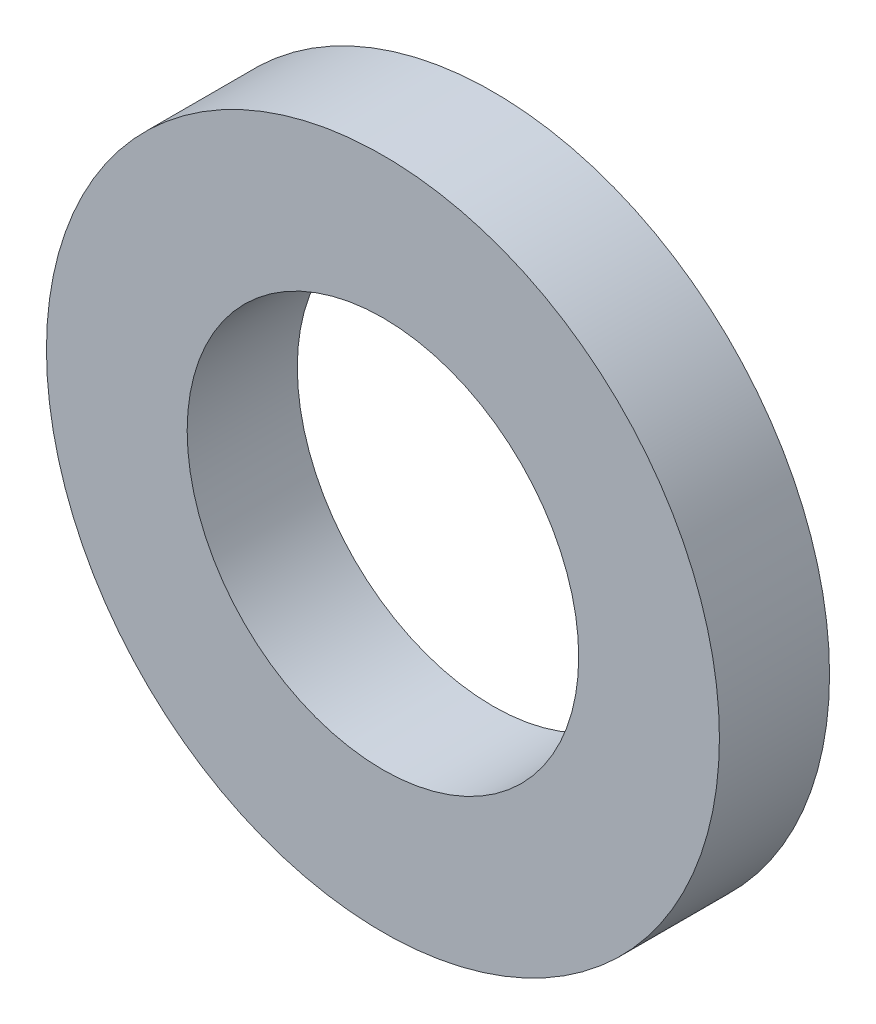
ISO-10303-21;
HEADER;
FILE_DESCRIPTION(('STEP AP214'),'2;1');
FILE_NAME('part.step','',(''),(''),'','','');
FILE_SCHEMA(('AUTOMOTIVE_DESIGN { 1 0 10303 214 1 1 1 1 }'));
ENDSEC;
DATA;
#1=APPLICATION_CONTEXT('core data for automotive mechanical design processes');
#2=APPLICATION_PROTOCOL_DEFINITION('international standard','automotive_design',2000,#1);
#3=PRODUCT_CONTEXT('',#1,'mechanical');
#4=PRODUCT('Part','Part','',(#3));
#5=PRODUCT_RELATED_PRODUCT_CATEGORY('part','',(#4));
#6=PRODUCT_DEFINITION_FORMATION('','',#4);
#7=PRODUCT_DEFINITION_CONTEXT('part definition',#1,'design');
#8=PRODUCT_DEFINITION('design','',#6,#7);
#9=PRODUCT_DEFINITION_SHAPE('','',#8);
#10=(LENGTH_UNIT() NAMED_UNIT(*) SI_UNIT(.MILLI.,.METRE.));
#11=(NAMED_UNIT(*) PLANE_ANGLE_UNIT() SI_UNIT($,.RADIAN.));
#12=(NAMED_UNIT(*) SI_UNIT($,.STERADIAN.) SOLID_ANGLE_UNIT());
#13=UNCERTAINTY_MEASURE_WITH_UNIT(LENGTH_MEASURE(1.E-05),#10,'distance_accuracy_value','');
#14=(GEOMETRIC_REPRESENTATION_CONTEXT(3) GLOBAL_UNCERTAINTY_ASSIGNED_CONTEXT((#13)) GLOBAL_UNIT_ASSIGNED_CONTEXT((#10,
#11,#12)) REPRESENTATION_CONTEXT('',''));
#15=CARTESIAN_POINT('',(0.,0.,0.));
#16=DIRECTION('',(0.,0.,1.));
#17=DIRECTION('',(1.,0.,0.));
#18=AXIS2_PLACEMENT_3D('',#15,#16,#17);
#19=CARTESIAN_POINT('',(-1.52655665885959E-13,3.33066907387547E-13,1.80000000000002));
#20=DIRECTION('',(0.,0.,0.999999999999913));
#21=DIRECTION('',(0.999999999999978,0.,0.));
#22=AXIS2_PLACEMENT_3D('',#19,#20,#21);
#23=PLANE('',#22);
#24=CARTESIAN_POINT('',(-1.52655665885959E-13,3.33066907387547E-13,1.80000000000002));
#25=DIRECTION('',(0.,0.,0.999999999999913));
#26=DIRECTION('',(0.999999999999978,0.,0.));
#27=AXIS2_PLACEMENT_3D('',#24,#25,#26);
#28=CIRCLE('',#27,5.5);
#29=CARTESIAN_POINT('',(-5.50000000000003,0.,1.80000000000018));
#30=VERTEX_POINT('',#29);
#31=EDGE_CURVE('E12',#30,#30,#28,.T.);
#32=ORIENTED_EDGE('',*,*,#31,.T.);
#33=EDGE_LOOP('',(#32));
#34=FACE_BOUND('',#33,.T.);
#35=CARTESIAN_POINT('',(-1.52655665885959E-13,3.33066907387547E-13,1.80000000000002));
#36=DIRECTION('',(0.,0.,0.999999999999913));
#37=DIRECTION('',(0.999999999999978,0.,0.));
#38=AXIS2_PLACEMENT_3D('',#35,#36,#37);
#39=CIRCLE('',#38,3.2);
#40=CARTESIAN_POINT('',(-3.20000000000008,1.68576264059087E-13,1.80000000000011));
#41=VERTEX_POINT('',#40);
#42=EDGE_CURVE('E51',#41,#41,#39,.T.);
#43=ORIENTED_EDGE('',*,*,#42,.F.);
#44=EDGE_LOOP('',(#43));
#45=FACE_BOUND('',#44,.T.);
#46=ADVANCED_FACE('F40',(#34,#45),#23,.T.);
#47=CARTESIAN_POINT('',(0.,0.,0.));
#48=DIRECTION('',(0.,0.,0.999999999999913));
#49=DIRECTION('',(0.999999999999978,0.,0.));
#50=AXIS2_PLACEMENT_3D('',#47,#48,#49);
#51=PLANE('',#50);
#52=CARTESIAN_POINT('',(0.,0.,0.));
#53=DIRECTION('',(0.,0.,0.999999999999913));
#54=DIRECTION('',(0.999999999999978,0.,0.));
#55=AXIS2_PLACEMENT_3D('',#52,#53,#54);
#56=CIRCLE('',#55,5.5);
#57=CARTESIAN_POINT('',(-5.50000000000008,0.,1.51571463713474E-13));
#58=VERTEX_POINT('',#57);
#59=EDGE_CURVE('E44',#58,#58,#56,.T.);
#60=ORIENTED_EDGE('',*,*,#59,.F.);
#61=EDGE_LOOP('',(#60));
#62=FACE_BOUND('',#61,.T.);
#63=CARTESIAN_POINT('',(0.,0.,0.));
#64=DIRECTION('',(0.,0.,0.999999999999913));
#65=DIRECTION('',(0.999999999999978,0.,0.));
#66=AXIS2_PLACEMENT_3D('',#63,#64,#65);
#67=CIRCLE('',#66,3.2);
#68=CARTESIAN_POINT('',(-3.20000000000013,1.35958779787182E-13,0.));
#69=VERTEX_POINT('',#68);
#70=EDGE_CURVE('E53',#69,#69,#67,.T.);
#71=ORIENTED_EDGE('',*,*,#70,.T.);
#72=EDGE_LOOP('',(#71));
#73=FACE_BOUND('',#72,.T.);
#74=ADVANCED_FACE('F63',(#62,#73),#51,.F.);
#75=CARTESIAN_POINT('',(-1.52655665885959E-13,3.33066907387547E-13,1.80000000000002));
#76=DIRECTION('',(0.,0.,-0.999999999999913));
#77=DIRECTION('',(-0.999999999999978,0.,0.));
#78=AXIS2_PLACEMENT_3D('',#75,#76,#77);
#79=CYLINDRICAL_SURFACE('',#78,5.5);
#80=CARTESIAN_POINT('',(-5.50000000000003,0.,1.80000000000018));
#81=CARTESIAN_POINT('',(-5.50000000000003,0.,1.78125000000018));
#82=CARTESIAN_POINT('',(-5.50000000000003,0.,1.76250000000017));
#83=CARTESIAN_POINT('',(-5.50000000000003,0.,1.72500000000017));
#84=CARTESIAN_POINT('',(-5.50000000000003,0.,1.70625000000017));
#85=CARTESIAN_POINT('',(-5.50000000000003,0.,1.66875000000017));
#86=CARTESIAN_POINT('',(-5.50000000000003,0.,1.65000000000017));
#87=CARTESIAN_POINT('',(-5.50000000000003,0.,1.61250000000017));
#88=CARTESIAN_POINT('',(-5.50000000000003,0.,1.59375000000017));
#89=CARTESIAN_POINT('',(-5.50000000000004,0.,1.55625000000017));
#90=CARTESIAN_POINT('',(-5.50000000000004,0.,1.53750000000017));
#91=CARTESIAN_POINT('',(-5.50000000000004,0.,1.50000000000017));
#92=CARTESIAN_POINT('',(-5.50000000000004,0.,1.48125000000017));
#93=CARTESIAN_POINT('',(-5.50000000000004,0.,1.44375000000017));
#94=CARTESIAN_POINT('',(-5.50000000000004,0.,1.42500000000017));
#95=CARTESIAN_POINT('',(-5.50000000000004,0.,1.38750000000017));
#96=CARTESIAN_POINT('',(-5.50000000000004,0.,1.36875000000017));
#97=CARTESIAN_POINT('',(-5.50000000000004,0.,1.33125000000017));
#98=CARTESIAN_POINT('',(-5.50000000000004,0.,1.31250000000017));
#99=CARTESIAN_POINT('',(-5.50000000000004,0.,1.27500000000017));
#100=CARTESIAN_POINT('',(-5.50000000000004,0.,1.25625000000017));
#101=CARTESIAN_POINT('',(-5.50000000000005,0.,1.21875000000017));
#102=CARTESIAN_POINT('',(-5.50000000000005,0.,1.20000000000017));
#103=CARTESIAN_POINT('',(-5.50000000000005,0.,1.16250000000017));
#104=CARTESIAN_POINT('',(-5.50000000000005,0.,1.14375000000017));
#105=CARTESIAN_POINT('',(-5.50000000000005,0.,1.10625000000017));
#106=CARTESIAN_POINT('',(-5.50000000000005,0.,1.08750000000017));
#107=CARTESIAN_POINT('',(-5.50000000000005,0.,1.05000000000017));
#108=CARTESIAN_POINT('',(-5.50000000000005,0.,1.03125000000017));
#109=CARTESIAN_POINT('',(-5.50000000000005,0.,0.993750000000165));
#110=CARTESIAN_POINT('',(-5.50000000000005,0.,0.975000000000164));
#111=CARTESIAN_POINT('',(-5.50000000000005,0.,0.937500000000164));
#112=CARTESIAN_POINT('',(-5.50000000000005,0.,0.918750000000164));
#113=CARTESIAN_POINT('',(-5.50000000000005,0.,0.881250000000163));
#114=CARTESIAN_POINT('',(-5.50000000000006,0.,0.862500000000163));
#115=CARTESIAN_POINT('',(-5.50000000000006,0.,0.825000000000162));
#116=CARTESIAN_POINT('',(-5.50000000000006,0.,0.806250000000162));
#117=CARTESIAN_POINT('',(-5.50000000000006,0.,0.768750000000162));
#118=CARTESIAN_POINT('',(-5.50000000000006,0.,0.750000000000161));
#119=CARTESIAN_POINT('',(-5.50000000000006,0.,0.712500000000161));
#120=CARTESIAN_POINT('',(-5.50000000000006,0.,0.693750000000161));
#121=CARTESIAN_POINT('',(-5.50000000000006,0.,0.65625000000016));
#122=CARTESIAN_POINT('',(-5.50000000000006,0.,0.63750000000016));
#123=CARTESIAN_POINT('',(-5.50000000000006,0.,0.60000000000016));
#124=CARTESIAN_POINT('',(-5.50000000000006,0.,0.581250000000159));
#125=CARTESIAN_POINT('',(-5.50000000000006,0.,0.543750000000159));
#126=CARTESIAN_POINT('',(-5.50000000000006,0.,0.525000000000158));
#127=CARTESIAN_POINT('',(-5.50000000000007,0.,0.487500000000158));
#128=CARTESIAN_POINT('',(-5.50000000000007,0.,0.468750000000158));
#129=CARTESIAN_POINT('',(-5.50000000000007,0.,0.431250000000157));
#130=CARTESIAN_POINT('',(-5.50000000000007,0.,0.412500000000157));
#131=CARTESIAN_POINT('',(-5.50000000000007,0.,0.375000000000156));
#132=CARTESIAN_POINT('',(-5.50000000000007,0.,0.356250000000156));
#133=CARTESIAN_POINT('',(-5.50000000000007,0.,0.318750000000156));
#134=CARTESIAN_POINT('',(-5.50000000000007,0.,0.300000000000156));
#135=CARTESIAN_POINT('',(-5.50000000000007,0.,0.262500000000155));
#136=CARTESIAN_POINT('',(-5.50000000000007,0.,0.243750000000155));
#137=CARTESIAN_POINT('',(-5.50000000000007,0.,0.206250000000154));
#138=CARTESIAN_POINT('',(-5.50000000000007,0.,0.187500000000154));
#139=CARTESIAN_POINT('',(-5.50000000000008,0.,0.150000000000153));
#140=CARTESIAN_POINT('',(-5.50000000000008,0.,0.131250000000153));
#141=CARTESIAN_POINT('',(-5.50000000000008,0.,0.0937500000001527));
#142=CARTESIAN_POINT('',(-5.50000000000008,0.,0.0750000000001525));
#143=CARTESIAN_POINT('',(-5.50000000000008,0.,0.0375000000001521));
#144=CARTESIAN_POINT('',(-5.50000000000008,0.,0.0187500000001518));
#145=CARTESIAN_POINT('',(-5.50000000000008,0.,1.51571463713474E-13));
#146=B_SPLINE_CURVE_WITH_KNOTS('',3,(#80,#81,#82,#83,#84,#85,#86,#87,#88,#89,#90,#91,#92,#93,
#94,#95,#96,#97,#98,#99,#100,#101,#102,#103,#104,#105,#106,#107,#108,#109,#110,#111,#112,#113,
#114,#115,#116,#117,#118,#119,#120,#121,#122,#123,#124,#125,#126,#127,#128,#129,#130,#131,#132,
#133,#134,#135,#136,#137,#138,#139,#140,#141,#142,#143,#144,#145),.UNSPECIFIED.,.F.,.F.,(4,2,2,
2,2,2,2,2,2,2,2,2,2,2,2,2,2,2,2,2,2,2,2,2,2,2,2,2,2,2,2,2,4),(0.,0.0562500000000005,
0.112500000000001,0.168750000000002,0.225000000000003,0.281250000000003,0.337500000000004,
0.393750000000005,0.450000000000006,0.506250000000007,0.562500000000007,0.618750000000008,
0.675000000000009,0.73125000000001,0.78750000000001,0.843750000000011,0.900000000000012,
0.956250000000013,1.01250000000001,1.06875000000001,1.12500000000001,1.18125000000002,
1.23750000000002,1.29375000000002,1.35000000000002,1.40625000000002,1.46250000000002,
1.51875000000002,1.57500000000002,1.63125000000002,1.68750000000002,1.74375000000002,
1.80000000000002),.UNSPECIFIED.);
#147=EDGE_CURVE('BSEAM42',#30,#58,#146,.T.);
#148=ORIENTED_EDGE('',*,*,#31,.F.);
#149=ORIENTED_EDGE('',*,*,#59,.T.);
#150=ORIENTED_EDGE('',*,*,#147,.T.);
#151=ORIENTED_EDGE('',*,*,#147,.F.);
#152=EDGE_LOOP('',(#148,#150,#149,#151));
#153=FACE_BOUND('',#152,.T.);
#154=ADVANCED_FACE('F42',(#153),#79,.T.);
#155=CARTESIAN_POINT('',(-1.52655665885959E-13,3.33066907387547E-13,1.80000000000002));
#156=DIRECTION('',(0.,0.,-0.999999999999913));
#157=DIRECTION('',(-0.999999999999978,0.,0.));
#158=AXIS2_PLACEMENT_3D('',#155,#156,#157);
#159=CYLINDRICAL_SURFACE('',#158,3.2);
#160=CARTESIAN_POINT('',(-3.20000000000008,1.68576264059087E-13,1.80000000000011));
#161=CARTESIAN_POINT('',(-3.20000000000008,1.68236498597921E-13,1.78125000000011));
#162=CARTESIAN_POINT('',(-3.20000000000008,1.67896733136756E-13,1.76250000000011));
#163=CARTESIAN_POINT('',(-3.20000000000008,1.67217202214424E-13,1.72500000000011));
#164=CARTESIAN_POINT('',(-3.20000000000008,1.66877436753259E-13,1.70625000000011));
#165=CARTESIAN_POINT('',(-3.20000000000008,1.66197905830927E-13,1.66875000000011));
#166=CARTESIAN_POINT('',(-3.20000000000009,1.65858140369762E-13,1.65000000000011));
#167=CARTESIAN_POINT('',(-3.20000000000009,1.6517860944743E-13,1.61250000000011));
#168=CARTESIAN_POINT('',(-3.20000000000009,1.64838843986264E-13,1.59375000000011));
#169=CARTESIAN_POINT('',(-3.20000000000009,1.64159313063933E-13,1.55625000000011));
#170=CARTESIAN_POINT('',(-3.20000000000009,1.63819547602767E-13,1.53750000000011));
#171=CARTESIAN_POINT('',(-3.20000000000009,1.63140016680436E-13,1.50000000000011));
#172=CARTESIAN_POINT('',(-3.20000000000009,1.6280025121927E-13,1.48125000000011));
#173=CARTESIAN_POINT('',(-3.20000000000009,1.62120720296939E-13,1.44375000000011));
#174=CARTESIAN_POINT('',(-3.20000000000009,1.61780954835773E-13,1.42500000000011));
#175=CARTESIAN_POINT('',(-3.20000000000009,1.61101423913442E-13,1.38750000000011));
#176=CARTESIAN_POINT('',(-3.20000000000009,1.60761658452276E-13,1.36875000000011));
#177=CARTESIAN_POINT('',(-3.20000000000009,1.60082127529945E-13,1.33125000000011));
#178=CARTESIAN_POINT('',(-3.20000000000009,1.59742362068779E-13,1.31250000000011));
#179=CARTESIAN_POINT('',(-3.2000000000001,1.59062831146448E-13,1.27500000000011));
#180=CARTESIAN_POINT('',(-3.2000000000001,1.58723065685282E-13,1.2562500000001));
#181=CARTESIAN_POINT('',(-3.2000000000001,1.58043534762951E-13,1.2187500000001));
#182=CARTESIAN_POINT('',(-3.2000000000001,1.57703769301785E-13,1.2000000000001));
#183=CARTESIAN_POINT('',(-3.2000000000001,1.57024238379454E-13,1.1625000000001));
#184=CARTESIAN_POINT('',(-3.2000000000001,1.56684472918288E-13,1.1437500000001));
#185=CARTESIAN_POINT('',(-3.2000000000001,1.56004941995957E-13,1.1062500000001));
#186=CARTESIAN_POINT('',(-3.2000000000001,1.55665176534791E-13,1.0875000000001));
#187=CARTESIAN_POINT('',(-3.2000000000001,1.5498564561246E-13,1.0500000000001));
#188=CARTESIAN_POINT('',(-3.2000000000001,1.54645880151294E-13,1.0312500000001));
#189=CARTESIAN_POINT('',(-3.2000000000001,1.53966349228963E-13,0.993750000000101));
#190=CARTESIAN_POINT('',(-3.2000000000001,1.53626583767797E-13,0.975000000000101));
#191=CARTESIAN_POINT('',(-3.2000000000001,1.52947052845466E-13,0.937500000000101));
#192=CARTESIAN_POINT('',(-3.20000000000011,1.526072873843E-13,0.9187500000001));
#193=CARTESIAN_POINT('',(-3.20000000000011,1.51927756461969E-13,0.8812500000001));
#194=CARTESIAN_POINT('',(-3.20000000000011,1.51587991000803E-13,0.8625000000001));
#195=CARTESIAN_POINT('',(-3.20000000000011,1.50908460078472E-13,0.825000000000099));
#196=CARTESIAN_POINT('',(-3.20000000000011,1.50568694617306E-13,0.806250000000099));
#197=CARTESIAN_POINT('',(-3.20000000000011,1.49889163694975E-13,0.768750000000098));
#198=CARTESIAN_POINT('',(-3.20000000000011,1.49549398233809E-13,0.750000000000098));
#199=CARTESIAN_POINT('',(-3.20000000000011,1.48869867311477E-13,0.712500000000098));
#200=CARTESIAN_POINT('',(-3.20000000000011,1.48530101850312E-13,0.693750000000098));
#201=CARTESIAN_POINT('',(-3.20000000000011,1.4785057092798E-13,0.656250000000097));
#202=CARTESIAN_POINT('',(-3.20000000000011,1.47510805466815E-13,0.637500000000097));
#203=CARTESIAN_POINT('',(-3.20000000000011,1.46831274544483E-13,0.600000000000096));
#204=CARTESIAN_POINT('',(-3.20000000000012,1.46491509083318E-13,0.581250000000096));
#205=CARTESIAN_POINT('',(-3.20000000000012,1.45811978160986E-13,0.543750000000096));
#206=CARTESIAN_POINT('',(-3.20000000000012,1.45472212699821E-13,0.525000000000095));
#207=CARTESIAN_POINT('',(-3.20000000000012,1.44792681777489E-13,0.487500000000095));
#208=CARTESIAN_POINT('',(-3.20000000000012,1.44452916316324E-13,0.468750000000095));
#209=CARTESIAN_POINT('',(-3.20000000000012,1.43773385393992E-13,0.431250000000094));
#210=CARTESIAN_POINT('',(-3.20000000000012,1.43433619932827E-13,0.412500000000094));
#211=CARTESIAN_POINT('',(-3.20000000000012,1.42754089010495E-13,0.375000000000093));
#212=CARTESIAN_POINT('',(-3.20000000000012,1.4241432354933E-13,0.356250000000093));
#213=CARTESIAN_POINT('',(-3.20000000000012,1.41734792626998E-13,0.318750000000093));
#214=CARTESIAN_POINT('',(-3.20000000000012,1.41395027165832E-13,0.300000000000092));
#215=CARTESIAN_POINT('',(-3.20000000000012,1.40715496243501E-13,0.262500000000092));
#216=CARTESIAN_POINT('',(-3.20000000000012,1.40375730782335E-13,0.243750000000092));
#217=CARTESIAN_POINT('',(-3.20000000000012,1.39696199860004E-13,0.206250000000091));
#218=CARTESIAN_POINT('',(-3.20000000000013,1.39356434398838E-13,0.187500000000091));
#219=CARTESIAN_POINT('',(-3.20000000000013,1.38676903476507E-13,0.15000000000009));
#220=CARTESIAN_POINT('',(-3.20000000000013,1.38337138015341E-13,0.13125000000009));
#221=CARTESIAN_POINT('',(-3.20000000000013,1.3765760709301E-13,0.0937500000000896));
#222=CARTESIAN_POINT('',(-3.20000000000013,1.37317841631844E-13,0.0750000000000894));
#223=CARTESIAN_POINT('',(-3.20000000000013,1.36638310709513E-13,0.037500000000089));
#224=CARTESIAN_POINT('',(-3.20000000000013,1.36298545248347E-13,0.0187500000000887));
#225=CARTESIAN_POINT('',(-3.20000000000013,1.35958779787182E-13,0.));
#226=B_SPLINE_CURVE_WITH_KNOTS('',3,(#160,#161,#162,#163,#164,#165,#166,#167,#168,#169,#170,
#171,#172,#173,#174,#175,#176,#177,#178,#179,#180,#181,#182,#183,#184,#185,#186,#187,#188,#189,
#190,#191,#192,#193,#194,#195,#196,#197,#198,#199,#200,#201,#202,#203,#204,#205,#206,#207,#208,
#209,#210,#211,#212,#213,#214,#215,#216,#217,#218,#219,#220,#221,#222,#223,#224,#225),
.UNSPECIFIED.,.F.,.F.,(4,2,2,2,2,2,2,2,2,2,2,2,2,2,2,2,2,2,2,2,2,2,2,2,2,2,2,2,2,2,2,2,4),(0.,
0.0562500000000007,0.112500000000001,0.168750000000002,0.225000000000003,0.281250000000004,
0.337500000000004,0.393750000000005,0.450000000000006,0.506250000000007,0.562500000000007,
0.618750000000008,0.675000000000009,0.73125000000001,0.787500000000011,0.843750000000011,
0.900000000000012,0.956250000000013,1.01250000000001,1.06875000000001,1.12500000000001,
1.18125000000002,1.23750000000002,1.29375000000002,1.35000000000002,1.40625000000002,
1.46250000000002,1.51875000000002,1.57500000000002,1.63125000000002,1.68750000000002,
1.74375000000002,1.80000000000002),.UNSPECIFIED.);
#227=EDGE_CURVE('BSEAM59',#41,#69,#226,.T.);
#228=ORIENTED_EDGE('',*,*,#42,.T.);
#229=ORIENTED_EDGE('',*,*,#70,.F.);
#230=ORIENTED_EDGE('',*,*,#227,.T.);
#231=ORIENTED_EDGE('',*,*,#227,.F.);
#232=EDGE_LOOP('',(#228,#230,#229,#231));
#233=FACE_BOUND('',#232,.T.);
#234=ADVANCED_FACE('F59',(#233),#159,.F.);
#235=CLOSED_SHELL('',(#46,#74,#154,#234));
#236=MANIFOLD_SOLID_BREP('B2',#235);
#237=ADVANCED_BREP_SHAPE_REPRESENTATION('',(#18,#236),#14);
#238=SHAPE_DEFINITION_REPRESENTATION(#9,#237);
ENDSEC;
END-ISO-10303-21;
